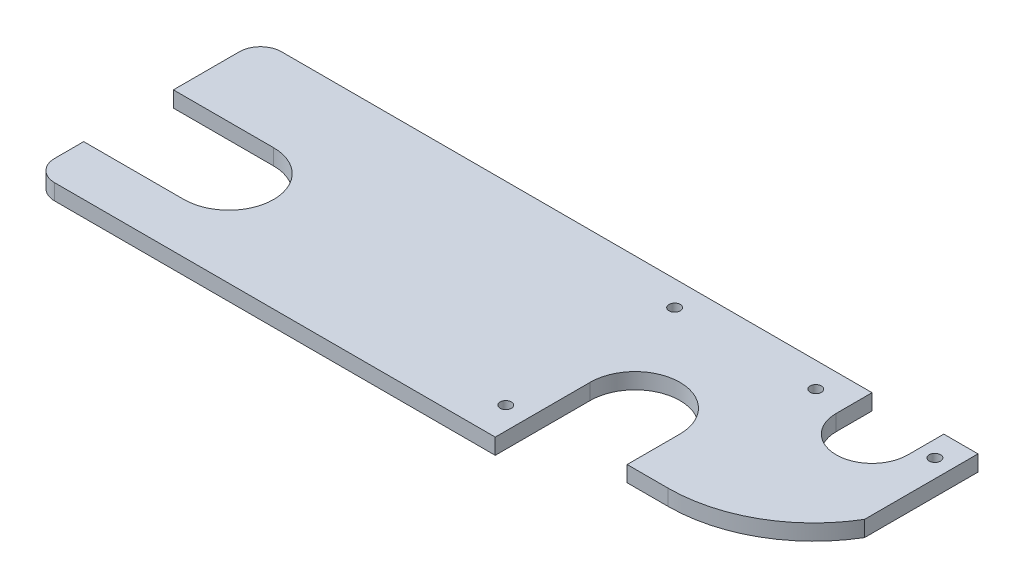
ISO-10303-21;
HEADER;
FILE_DESCRIPTION(('STEP AP214'),'2;1');
FILE_NAME('part.step','',(''),(''),'','','');
FILE_SCHEMA(('AUTOMOTIVE_DESIGN { 1 0 10303 214 1 1 1 1 }'));
ENDSEC;
DATA;
#1=APPLICATION_CONTEXT('core data for automotive mechanical design processes');
#2=APPLICATION_PROTOCOL_DEFINITION('international standard','automotive_design',2000,#1);
#3=PRODUCT_CONTEXT('',#1,'mechanical');
#4=PRODUCT('Part','Part','',(#3));
#5=PRODUCT_RELATED_PRODUCT_CATEGORY('part','',(#4));
#6=PRODUCT_DEFINITION_FORMATION('','',#4);
#7=PRODUCT_DEFINITION_CONTEXT('part definition',#1,'design');
#8=PRODUCT_DEFINITION('design','',#6,#7);
#9=PRODUCT_DEFINITION_SHAPE('','',#8);
#10=(LENGTH_UNIT() NAMED_UNIT(*) SI_UNIT(.MILLI.,.METRE.));
#11=(NAMED_UNIT(*) PLANE_ANGLE_UNIT() SI_UNIT($,.RADIAN.));
#12=(NAMED_UNIT(*) SI_UNIT($,.STERADIAN.) SOLID_ANGLE_UNIT());
#13=UNCERTAINTY_MEASURE_WITH_UNIT(LENGTH_MEASURE(1.E-05),#10,'distance_accuracy_value','');
#14=(GEOMETRIC_REPRESENTATION_CONTEXT(3) GLOBAL_UNCERTAINTY_ASSIGNED_CONTEXT((#13)) GLOBAL_UNIT_ASSIGNED_CONTEXT((#10,
#11,#12)) REPRESENTATION_CONTEXT('',''));
#15=CARTESIAN_POINT('',(0.,0.,0.));
#16=DIRECTION('',(0.,0.,1.));
#17=DIRECTION('',(1.,0.,0.));
#18=AXIS2_PLACEMENT_3D('',#15,#16,#17);
#19=CARTESIAN_POINT('',(12.7,9.525,-123.825));
#20=DIRECTION('',(0.,-1.,0.));
#21=DIRECTION('',(0.,0.,-1.));
#22=AXIS2_PLACEMENT_3D('',#19,#20,#21);
#23=CYLINDRICAL_SURFACE('',#22,12.7);
#24=CARTESIAN_POINT('',(12.7,0.,-123.825));
#25=DIRECTION('',(0.,-1.,0.));
#26=DIRECTION('',(0.,0.,-1.));
#27=AXIS2_PLACEMENT_3D('',#24,#25,#26);
#28=CIRCLE('',#27,12.7);
#29=CARTESIAN_POINT('',(0.,0.,-123.825));
#30=VERTEX_POINT('',#29);
#31=CARTESIAN_POINT('',(12.7,0.,-136.525));
#32=VERTEX_POINT('',#31);
#33=EDGE_CURVE('E237',#30,#32,#28,.T.);
#34=ORIENTED_EDGE('',*,*,#33,.F.);
#35=DIRECTION('',(0.,-1.,0.));
#36=VECTOR('',#35,1.);
#37=CARTESIAN_POINT('',(0.,9.525,-123.825));
#38=LINE('',#37,#36);
#39=CARTESIAN_POINT('',(0.,9.525,-123.825));
#40=VERTEX_POINT('',#39);
#41=EDGE_CURVE('E53',#40,#30,#38,.T.);
#42=ORIENTED_EDGE('',*,*,#41,.F.);
#43=CARTESIAN_POINT('',(12.7,9.525,-123.825));
#44=DIRECTION('',(0.,-1.,0.));
#45=DIRECTION('',(0.,0.,-1.));
#46=AXIS2_PLACEMENT_3D('',#43,#44,#45);
#47=CIRCLE('',#46,12.7);
#48=CARTESIAN_POINT('',(12.7,9.525,-136.525));
#49=VERTEX_POINT('',#48);
#50=EDGE_CURVE('E194',#40,#49,#47,.T.);
#51=ORIENTED_EDGE('',*,*,#50,.T.);
#52=DIRECTION('',(0.,-1.,0.));
#53=VECTOR('',#52,1.);
#54=CARTESIAN_POINT('',(12.7,9.525,-136.525));
#55=LINE('',#54,#53);
#56=EDGE_CURVE('E13',#49,#32,#55,.T.);
#57=ORIENTED_EDGE('',*,*,#56,.T.);
#58=EDGE_LOOP('',(#34,#42,#51,#57));
#59=FACE_BOUND('',#58,.T.);
#60=ADVANCED_FACE('F44',(#59),#23,.T.);
#61=CARTESIAN_POINT('',(0.,9.525,-96.8375000000001));
#62=DIRECTION('',(-1.,0.,0.));
#63=DIRECTION('',(0.,0.,1.));
#64=AXIS2_PLACEMENT_3D('',#61,#62,#63);
#65=PLANE('',#64);
#66=DIRECTION('',(0.,0.,-1.));
#67=VECTOR('',#66,1.);
#68=CARTESIAN_POINT('',(0.,0.,-96.8375000000001));
#69=LINE('',#68,#67);
#70=CARTESIAN_POINT('',(0.,0.,-84.1375));
#71=VERTEX_POINT('',#70);
#72=EDGE_CURVE('E188',#71,#30,#69,.T.);
#73=ORIENTED_EDGE('',*,*,#72,.F.);
#74=DIRECTION('',(0.,-1.,0.));
#75=VECTOR('',#74,1.);
#76=CARTESIAN_POINT('',(0.,9.525,-84.1375));
#77=LINE('',#76,#75);
#78=CARTESIAN_POINT('',(0.,9.525,-84.1375));
#79=VERTEX_POINT('',#78);
#80=EDGE_CURVE('E174',#79,#71,#77,.T.);
#81=ORIENTED_EDGE('',*,*,#80,.F.);
#82=DIRECTION('',(0.,0.,-1.));
#83=VECTOR('',#82,1.);
#84=CARTESIAN_POINT('',(0.,9.525,-84.1375));
#85=LINE('',#84,#83);
#86=EDGE_CURVE('E181',#79,#40,#85,.T.);
#87=ORIENTED_EDGE('',*,*,#86,.T.);
#88=ORIENTED_EDGE('',*,*,#41,.T.);
#89=EDGE_LOOP('',(#73,#81,#87,#88));
#90=FACE_BOUND('',#89,.T.);
#91=ADVANCED_FACE('F185',(#90),#65,.T.);
#92=CARTESIAN_POINT('',(22.2250000000001,9.525,-84.1375));
#93=DIRECTION('',(0.,0.,1.));
#94=DIRECTION('',(1.,0.,0.));
#95=AXIS2_PLACEMENT_3D('',#92,#93,#94);
#96=PLANE('',#95);
#97=DIRECTION('',(-1.,0.,0.));
#98=VECTOR('',#97,1.);
#99=CARTESIAN_POINT('',(22.2250000000001,0.,-84.1375));
#100=LINE('',#99,#98);
#101=CARTESIAN_POINT('',(60.325,0.,-84.1375));
#102=VERTEX_POINT('',#101);
#103=EDGE_CURVE('E234',#102,#71,#100,.T.);
#104=ORIENTED_EDGE('',*,*,#103,.F.);
#105=DIRECTION('',(0.,-1.,0.));
#106=VECTOR('',#105,1.);
#107=CARTESIAN_POINT('',(60.325,9.525,-84.1375));
#108=LINE('',#107,#106);
#109=CARTESIAN_POINT('',(60.325,9.525,-84.1375));
#110=VERTEX_POINT('',#109);
#111=EDGE_CURVE('E177',#110,#102,#108,.T.);
#112=ORIENTED_EDGE('',*,*,#111,.F.);
#113=DIRECTION('',(-1.,0.,0.));
#114=VECTOR('',#113,1.);
#115=CARTESIAN_POINT('',(60.325,9.525,-84.1375));
#116=LINE('',#115,#114);
#117=EDGE_CURVE('E171',#110,#79,#116,.T.);
#118=ORIENTED_EDGE('',*,*,#117,.T.);
#119=ORIENTED_EDGE('',*,*,#80,.T.);
#120=EDGE_LOOP('',(#104,#112,#118,#119));
#121=FACE_BOUND('',#120,.T.);
#122=ADVANCED_FACE('F173',(#121),#96,.T.);
#123=CARTESIAN_POINT('',(60.325,9.525,-57.15));
#124=DIRECTION('',(0.,-1.,0.));
#125=DIRECTION('',(0.,0.,-1.));
#126=AXIS2_PLACEMENT_3D('',#123,#124,#125);
#127=CYLINDRICAL_SURFACE('',#126,26.9875);
#128=CARTESIAN_POINT('',(60.325,0.,-57.15));
#129=DIRECTION('',(0.,-1.,0.));
#130=DIRECTION('',(0.,0.,-1.));
#131=AXIS2_PLACEMENT_3D('',#128,#129,#130);
#132=CIRCLE('',#131,26.9875);
#133=CARTESIAN_POINT('',(60.325,0.,-30.1625));
#134=VERTEX_POINT('',#133);
#135=EDGE_CURVE('E232',#102,#134,#132,.T.);
#136=ORIENTED_EDGE('',*,*,#135,.T.);
#137=DIRECTION('',(0.,-1.,0.));
#138=VECTOR('',#137,1.);
#139=CARTESIAN_POINT('',(60.325,9.525,-30.1625));
#140=LINE('',#139,#138);
#141=CARTESIAN_POINT('',(60.325,9.525,-30.1625));
#142=VERTEX_POINT('',#141);
#143=EDGE_CURVE('E242',#142,#134,#140,.T.);
#144=ORIENTED_EDGE('',*,*,#143,.F.);
#145=CARTESIAN_POINT('',(60.325,9.525,-57.15));
#146=DIRECTION('',(0.,1.,0.));
#147=DIRECTION('',(0.,0.,1.));
#148=AXIS2_PLACEMENT_3D('',#145,#146,#147);
#149=CIRCLE('',#148,26.9875);
#150=EDGE_CURVE('E182',#142,#110,#149,.T.);
#151=ORIENTED_EDGE('',*,*,#150,.T.);
#152=ORIENTED_EDGE('',*,*,#111,.T.);
#153=EDGE_LOOP('',(#136,#144,#151,#152));
#154=FACE_BOUND('',#153,.T.);
#155=ADVANCED_FACE('F293',(#154),#127,.F.);
#156=CARTESIAN_POINT('',(60.325,9.525,-30.1625));
#157=DIRECTION('',(0.,0.,1.));
#158=DIRECTION('',(1.,0.,0.));
#159=AXIS2_PLACEMENT_3D('',#156,#157,#158);
#160=PLANE('',#159);
#161=DIRECTION('',(-1.,0.,0.));
#162=VECTOR('',#161,1.);
#163=CARTESIAN_POINT('',(60.325,0.,-30.1625));
#164=LINE('',#163,#162);
#165=CARTESIAN_POINT('',(0.,0.,-30.1625));
#166=VERTEX_POINT('',#165);
#167=EDGE_CURVE('E230',#134,#166,#164,.T.);
#168=ORIENTED_EDGE('',*,*,#167,.T.);
#169=DIRECTION('',(0.,-1.,0.));
#170=VECTOR('',#169,1.);
#171=CARTESIAN_POINT('',(0.,9.525,-30.1625));
#172=LINE('',#171,#170);
#173=CARTESIAN_POINT('',(0.,9.525,-30.1625));
#174=VERTEX_POINT('',#173);
#175=EDGE_CURVE('E245',#174,#166,#172,.T.);
#176=ORIENTED_EDGE('',*,*,#175,.F.);
#177=DIRECTION('',(-1.,0.,0.));
#178=VECTOR('',#177,1.);
#179=CARTESIAN_POINT('',(22.2250000000001,9.525,-30.1625));
#180=LINE('',#179,#178);
#181=EDGE_CURVE('E449',#142,#174,#180,.T.);
#182=ORIENTED_EDGE('',*,*,#181,.F.);
#183=ORIENTED_EDGE('',*,*,#143,.T.);
#184=EDGE_LOOP('',(#168,#176,#182,#183));
#185=FACE_BOUND('',#184,.T.);
#186=ADVANCED_FACE('F296',(#185),#160,.F.);
#187=CARTESIAN_POINT('',(0.,9.525,-30.1625));
#188=DIRECTION('',(1.,0.,0.));
#189=DIRECTION('',(0.,0.,-1.));
#190=AXIS2_PLACEMENT_3D('',#187,#188,#189);
#191=PLANE('',#190);
#192=DIRECTION('',(0.,0.,1.));
#193=VECTOR('',#192,1.);
#194=CARTESIAN_POINT('',(0.,0.,-30.1625));
#195=LINE('',#194,#193);
#196=CARTESIAN_POINT('',(0.,0.,-12.7000000000001));
#197=VERTEX_POINT('',#196);
#198=EDGE_CURVE('E228',#166,#197,#195,.T.);
#199=ORIENTED_EDGE('',*,*,#198,.T.);
#200=DIRECTION('',(0.,-1.,0.));
#201=VECTOR('',#200,1.);
#202=CARTESIAN_POINT('',(0.,9.525,-12.7000000000001));
#203=LINE('',#202,#201);
#204=CARTESIAN_POINT('',(0.,9.525,-12.7000000000001));
#205=VERTEX_POINT('',#204);
#206=EDGE_CURVE('E248',#205,#197,#203,.T.);
#207=ORIENTED_EDGE('',*,*,#206,.F.);
#208=DIRECTION('',(0.,0.,1.));
#209=VECTOR('',#208,1.);
#210=CARTESIAN_POINT('',(0.,9.525,-17.4624999999999));
#211=LINE('',#210,#209);
#212=EDGE_CURVE('E447',#174,#205,#211,.T.);
#213=ORIENTED_EDGE('',*,*,#212,.F.);
#214=ORIENTED_EDGE('',*,*,#175,.T.);
#215=EDGE_LOOP('',(#199,#207,#213,#214));
#216=FACE_BOUND('',#215,.T.);
#217=ADVANCED_FACE('F300',(#216),#191,.F.);
#218=CARTESIAN_POINT('',(12.7,9.525,-12.7));
#219=DIRECTION('',(0.,-1.,0.));
#220=DIRECTION('',(0.,0.,-1.));
#221=AXIS2_PLACEMENT_3D('',#218,#219,#220);
#222=CYLINDRICAL_SURFACE('',#221,12.7);
#223=CARTESIAN_POINT('',(12.7,0.,-12.7));
#224=DIRECTION('',(0.,1.,0.));
#225=DIRECTION('',(0.,0.,1.));
#226=AXIS2_PLACEMENT_3D('',#223,#224,#225);
#227=CIRCLE('',#226,12.7);
#228=CARTESIAN_POINT('',(12.7000000000001,0.,0.));
#229=VERTEX_POINT('',#228);
#230=EDGE_CURVE('E226',#197,#229,#227,.T.);
#231=ORIENTED_EDGE('',*,*,#230,.T.);
#232=DIRECTION('',(0.,-1.,0.));
#233=VECTOR('',#232,1.);
#234=CARTESIAN_POINT('',(12.7000000000001,9.525,0.));
#235=LINE('',#234,#233);
#236=CARTESIAN_POINT('',(12.7000000000001,9.525,0.));
#237=VERTEX_POINT('',#236);
#238=EDGE_CURVE('E251',#237,#229,#235,.T.);
#239=ORIENTED_EDGE('',*,*,#238,.F.);
#240=CARTESIAN_POINT('',(12.7,9.525,-12.7));
#241=DIRECTION('',(0.,1.,0.));
#242=DIRECTION('',(0.,0.,1.));
#243=AXIS2_PLACEMENT_3D('',#240,#241,#242);
#244=CIRCLE('',#243,12.7);
#245=EDGE_CURVE('E444',#205,#237,#244,.T.);
#246=ORIENTED_EDGE('',*,*,#245,.F.);
#247=ORIENTED_EDGE('',*,*,#206,.T.);
#248=EDGE_LOOP('',(#231,#239,#246,#247));
#249=FACE_BOUND('',#248,.T.);
#250=ADVANCED_FACE('F304',(#249),#222,.T.);
#251=CARTESIAN_POINT('',(12.7000000000001,9.525,0.));
#252=DIRECTION('',(0.,0.,-1.));
#253=DIRECTION('',(-1.,0.,0.));
#254=AXIS2_PLACEMENT_3D('',#251,#252,#253);
#255=PLANE('',#254);
#256=DIRECTION('',(1.,0.,0.));
#257=VECTOR('',#256,1.);
#258=CARTESIAN_POINT('',(12.7000000000001,0.,0.));
#259=LINE('',#258,#257);
#260=CARTESIAN_POINT('',(277.8125,0.,0.));
#261=VERTEX_POINT('',#260);
#262=EDGE_CURVE('E224',#229,#261,#259,.T.);
#263=ORIENTED_EDGE('',*,*,#262,.T.);
#264=DIRECTION('',(0.,-1.,0.));
#265=VECTOR('',#264,1.);
#266=CARTESIAN_POINT('',(277.8125,9.525,0.));
#267=LINE('',#266,#265);
#268=CARTESIAN_POINT('',(277.8125,9.525,0.));
#269=VERTEX_POINT('',#268);
#270=EDGE_CURVE('E254',#269,#261,#267,.T.);
#271=ORIENTED_EDGE('',*,*,#270,.F.);
#272=DIRECTION('',(1.,0.,0.));
#273=VECTOR('',#272,1.);
#274=CARTESIAN_POINT('',(25.4,9.525,0.));
#275=LINE('',#274,#273);
#276=EDGE_CURVE('E442',#237,#269,#275,.T.);
#277=ORIENTED_EDGE('',*,*,#276,.F.);
#278=ORIENTED_EDGE('',*,*,#238,.T.);
#279=EDGE_LOOP('',(#263,#271,#277,#278));
#280=FACE_BOUND('',#279,.T.);
#281=ADVANCED_FACE('F308',(#280),#255,.F.);
#282=CARTESIAN_POINT('',(277.8125,9.525,-57.15));
#283=DIRECTION('',(1.,0.,0.));
#284=DIRECTION('',(0.,0.,-1.));
#285=AXIS2_PLACEMENT_3D('',#282,#283,#284);
#286=PLANE('',#285);
#287=DIRECTION('',(0.,0.,1.));
#288=VECTOR('',#287,1.);
#289=CARTESIAN_POINT('',(277.8125,0.,-57.15));
#290=LINE('',#289,#288);
#291=CARTESIAN_POINT('',(277.812500035128,0.,-57.15));
#292=VERTEX_POINT('',#291);
#293=EDGE_CURVE('E221',#292,#261,#290,.T.);
#294=ORIENTED_EDGE('',*,*,#293,.F.);
#295=DIRECTION('',(0.,-1.,0.));
#296=VECTOR('',#295,1.);
#297=CARTESIAN_POINT('',(277.812500035128,9.525,-57.15));
#298=LINE('',#297,#296);
#299=CARTESIAN_POINT('',(277.812500035128,9.525,-57.15));
#300=VERTEX_POINT('',#299);
#301=EDGE_CURVE('E257',#300,#292,#298,.T.);
#302=ORIENTED_EDGE('',*,*,#301,.F.);
#303=DIRECTION('',(0.,0.,1.));
#304=VECTOR('',#303,1.);
#305=CARTESIAN_POINT('',(277.8125,9.525,-57.15));
#306=LINE('',#305,#304);
#307=EDGE_CURVE('E439',#300,#269,#306,.T.);
#308=ORIENTED_EDGE('',*,*,#307,.T.);
#309=ORIENTED_EDGE('',*,*,#270,.T.);
#310=EDGE_LOOP('',(#294,#302,#308,#309));
#311=FACE_BOUND('',#310,.T.);
#312=ADVANCED_FACE('F312',(#311),#286,.T.);
#313=CARTESIAN_POINT('',(304.8,9.525,-57.15));
#314=DIRECTION('',(0.,-1.,0.));
#315=DIRECTION('',(0.,0.,-1.));
#316=AXIS2_PLACEMENT_3D('',#313,#314,#315);
#317=CYLINDRICAL_SURFACE('',#316,26.9874999648723);
#318=CARTESIAN_POINT('',(304.8,0.,-57.15));
#319=DIRECTION('',(0.,-1.,0.));
#320=DIRECTION('',(0.,0.,-1.));
#321=AXIS2_PLACEMENT_3D('',#318,#319,#320);
#322=CIRCLE('',#321,26.9874999648723);
#323=CARTESIAN_POINT('',(331.787499929745,0.,-57.15));
#324=VERTEX_POINT('',#323);
#325=EDGE_CURVE('E219',#292,#324,#322,.T.);
#326=ORIENTED_EDGE('',*,*,#325,.T.);
#327=DIRECTION('',(0.,-1.,0.));
#328=VECTOR('',#327,1.);
#329=CARTESIAN_POINT('',(331.787499929745,9.525,-57.15));
#330=LINE('',#329,#328);
#331=CARTESIAN_POINT('',(331.787499929745,9.525,-57.15));
#332=VERTEX_POINT('',#331);
#333=EDGE_CURVE('E259',#332,#324,#330,.T.);
#334=ORIENTED_EDGE('',*,*,#333,.F.);
#335=CARTESIAN_POINT('',(304.8,9.525,-57.15));
#336=DIRECTION('',(0.,-1.,0.));
#337=DIRECTION('',(0.,0.,-1.));
#338=AXIS2_PLACEMENT_3D('',#335,#336,#337);
#339=CIRCLE('',#338,26.9874999648723);
#340=EDGE_CURVE('E437',#300,#332,#339,.T.);
#341=ORIENTED_EDGE('',*,*,#340,.F.);
#342=ORIENTED_EDGE('',*,*,#301,.T.);
#343=EDGE_LOOP('',(#326,#334,#341,#342));
#344=FACE_BOUND('',#343,.T.);
#345=ADVANCED_FACE('F316',(#344),#317,.F.);
#346=CARTESIAN_POINT('',(331.787499929745,9.525,-57.15));
#347=DIRECTION('',(1.,0.,0.));
#348=DIRECTION('',(0.,0.,-1.));
#349=AXIS2_PLACEMENT_3D('',#346,#347,#348);
#350=PLANE('',#349);
#351=DIRECTION('',(0.,0.,1.));
#352=VECTOR('',#351,1.);
#353=CARTESIAN_POINT('',(331.787499929745,0.,-57.15));
#354=LINE('',#353,#352);
#355=CARTESIAN_POINT('',(331.787499929745,0.,-25.4));
#356=VERTEX_POINT('',#355);
#357=EDGE_CURVE('E216',#324,#356,#354,.T.);
#358=ORIENTED_EDGE('',*,*,#357,.T.);
#359=DIRECTION('',(0.,1.,0.));
#360=VECTOR('',#359,1.);
#361=CARTESIAN_POINT('',(331.787499929745,0.,-25.4));
#362=LINE('',#361,#360);
#363=CARTESIAN_POINT('',(331.787499929745,9.525,-25.4));
#364=VERTEX_POINT('',#363);
#365=EDGE_CURVE('E411',#356,#364,#362,.T.);
#366=ORIENTED_EDGE('',*,*,#365,.T.);
#367=DIRECTION('',(0.,0.,1.));
#368=VECTOR('',#367,1.);
#369=CARTESIAN_POINT('',(331.787499929745,9.525,-57.15));
#370=LINE('',#369,#368);
#371=EDGE_CURVE('E434',#332,#364,#370,.T.);
#372=ORIENTED_EDGE('',*,*,#371,.F.);
#373=ORIENTED_EDGE('',*,*,#333,.T.);
#374=EDGE_LOOP('',(#358,#366,#372,#373));
#375=FACE_BOUND('',#374,.T.);
#376=ADVANCED_FACE('F320',(#375),#350,.F.);
#377=CARTESIAN_POINT('',(431.8,9.525,-136.525));
#378=DIRECTION('',(1.,0.,0.));
#379=DIRECTION('',(0.,0.,-1.));
#380=AXIS2_PLACEMENT_3D('',#377,#378,#379);
#381=PLANE('',#380);
#382=DIRECTION('',(0.,0.,1.));
#383=VECTOR('',#382,1.);
#384=CARTESIAN_POINT('',(431.8,0.,-136.525));
#385=LINE('',#384,#383);
#386=CARTESIAN_POINT('',(431.8,0.,-136.525));
#387=VERTEX_POINT('',#386);
#388=CARTESIAN_POINT('',(431.8,0.,-68.2625));
#389=VERTEX_POINT('',#388);
#390=EDGE_CURVE('E213',#387,#389,#385,.T.);
#391=ORIENTED_EDGE('',*,*,#390,.F.);
#392=DIRECTION('',(0.,-1.,0.));
#393=VECTOR('',#392,1.);
#394=CARTESIAN_POINT('',(431.8,9.525,-136.525));
#395=LINE('',#394,#393);
#396=CARTESIAN_POINT('',(431.8,9.525,-136.525));
#397=VERTEX_POINT('',#396);
#398=EDGE_CURVE('E265',#397,#387,#395,.T.);
#399=ORIENTED_EDGE('',*,*,#398,.F.);
#400=DIRECTION('',(0.,0.,1.));
#401=VECTOR('',#400,1.);
#402=CARTESIAN_POINT('',(431.8,9.525,-136.525));
#403=LINE('',#402,#401);
#404=CARTESIAN_POINT('',(431.8,9.525,-68.2625));
#405=VERTEX_POINT('',#404);
#406=EDGE_CURVE('E431',#397,#405,#403,.T.);
#407=ORIENTED_EDGE('',*,*,#406,.T.);
#408=DIRECTION('',(0.,-1.,0.));
#409=VECTOR('',#408,1.);
#410=CARTESIAN_POINT('',(431.8,9.525,-68.2625));
#411=LINE('',#410,#409);
#412=EDGE_CURVE('E262',#405,#389,#411,.T.);
#413=ORIENTED_EDGE('',*,*,#412,.T.);
#414=EDGE_LOOP('',(#391,#399,#407,#413));
#415=FACE_BOUND('',#414,.T.);
#416=ADVANCED_FACE('F324',(#415),#381,.T.);
#417=CARTESIAN_POINT('',(411.226,9.525,-136.525));
#418=DIRECTION('',(0.,0.,-1.));
#419=DIRECTION('',(-1.,0.,0.));
#420=AXIS2_PLACEMENT_3D('',#417,#418,#419);
#421=PLANE('',#420);
#422=DIRECTION('',(1.,0.,0.));
#423=VECTOR('',#422,1.);
#424=CARTESIAN_POINT('',(411.226,0.,-136.525));
#425=LINE('',#424,#423);
#426=CARTESIAN_POINT('',(411.226,0.,-136.525));
#427=VERTEX_POINT('',#426);
#428=EDGE_CURVE('E210',#427,#387,#425,.T.);
#429=ORIENTED_EDGE('',*,*,#428,.F.);
#430=DIRECTION('',(0.,-1.,0.));
#431=VECTOR('',#430,1.);
#432=CARTESIAN_POINT('',(411.226,9.525,-136.525));
#433=LINE('',#432,#431);
#434=CARTESIAN_POINT('',(411.226,9.525,-136.525));
#435=VERTEX_POINT('',#434);
#436=EDGE_CURVE('E267',#435,#427,#433,.T.);
#437=ORIENTED_EDGE('',*,*,#436,.F.);
#438=DIRECTION('',(1.,0.,0.));
#439=VECTOR('',#438,1.);
#440=CARTESIAN_POINT('',(411.226,9.525,-136.525));
#441=LINE('',#440,#439);
#442=EDGE_CURVE('E428',#435,#397,#441,.T.);
#443=ORIENTED_EDGE('',*,*,#442,.T.);
#444=ORIENTED_EDGE('',*,*,#398,.T.);
#445=EDGE_LOOP('',(#429,#437,#443,#444));
#446=FACE_BOUND('',#445,.T.);
#447=ADVANCED_FACE('F328',(#446),#421,.T.);
#448=CARTESIAN_POINT('',(411.226,9.525,-114.935));
#449=DIRECTION('',(-1.,0.,0.));
#450=DIRECTION('',(0.,0.,1.));
#451=AXIS2_PLACEMENT_3D('',#448,#449,#450);
#452=PLANE('',#451);
#453=DIRECTION('',(0.,0.,-1.));
#454=VECTOR('',#453,1.);
#455=CARTESIAN_POINT('',(411.226,0.,-114.935));
#456=LINE('',#455,#454);
#457=CARTESIAN_POINT('',(411.226,0.,-114.935));
#458=VERTEX_POINT('',#457);
#459=EDGE_CURVE('E207',#458,#427,#456,.T.);
#460=ORIENTED_EDGE('',*,*,#459,.F.);
#461=DIRECTION('',(0.,-1.,0.));
#462=VECTOR('',#461,1.);
#463=CARTESIAN_POINT('',(411.226,9.525,-114.935));
#464=LINE('',#463,#462);
#465=CARTESIAN_POINT('',(411.226,9.525,-114.935));
#466=VERTEX_POINT('',#465);
#467=EDGE_CURVE('E269',#466,#458,#464,.T.);
#468=ORIENTED_EDGE('',*,*,#467,.F.);
#469=DIRECTION('',(0.,0.,-1.));
#470=VECTOR('',#469,1.);
#471=CARTESIAN_POINT('',(411.226,9.525,-114.935));
#472=LINE('',#471,#470);
#473=EDGE_CURVE('E425',#466,#435,#472,.T.);
#474=ORIENTED_EDGE('',*,*,#473,.T.);
#475=ORIENTED_EDGE('',*,*,#436,.T.);
#476=EDGE_LOOP('',(#460,#468,#474,#475));
#477=FACE_BOUND('',#476,.T.);
#478=ADVANCED_FACE('F332',(#477),#452,.T.);
#479=CARTESIAN_POINT('',(389.636,9.525,-114.935));
#480=DIRECTION('',(0.,-1.,0.));
#481=DIRECTION('',(0.,0.,-1.));
#482=AXIS2_PLACEMENT_3D('',#479,#480,#481);
#483=CYLINDRICAL_SURFACE('',#482,21.59);
#484=CARTESIAN_POINT('',(389.636,0.,-114.935));
#485=DIRECTION('',(0.,1.,0.));
#486=DIRECTION('',(0.,0.,1.));
#487=AXIS2_PLACEMENT_3D('',#484,#485,#486);
#488=CIRCLE('',#487,21.59);
#489=CARTESIAN_POINT('',(368.046,0.,-114.935));
#490=VERTEX_POINT('',#489);
#491=EDGE_CURVE('E204',#490,#458,#488,.T.);
#492=ORIENTED_EDGE('',*,*,#491,.F.);
#493=DIRECTION('',(0.,-1.,0.));
#494=VECTOR('',#493,1.);
#495=CARTESIAN_POINT('',(368.046,9.525,-114.935));
#496=LINE('',#495,#494);
#497=CARTESIAN_POINT('',(368.046,9.525,-114.935));
#498=VERTEX_POINT('',#497);
#499=EDGE_CURVE('E270',#498,#490,#496,.T.);
#500=ORIENTED_EDGE('',*,*,#499,.F.);
#501=CARTESIAN_POINT('',(389.636,9.525,-114.935));
#502=DIRECTION('',(0.,1.,0.));
#503=DIRECTION('',(0.,0.,1.));
#504=AXIS2_PLACEMENT_3D('',#501,#502,#503);
#505=CIRCLE('',#504,21.59);
#506=EDGE_CURVE('E422',#498,#466,#505,.T.);
#507=ORIENTED_EDGE('',*,*,#506,.T.);
#508=ORIENTED_EDGE('',*,*,#467,.T.);
#509=EDGE_LOOP('',(#492,#500,#507,#508));
#510=FACE_BOUND('',#509,.T.);
#511=ADVANCED_FACE('F336',(#510),#483,.F.);
#512=CARTESIAN_POINT('',(368.046,9.525,-114.935));
#513=DIRECTION('',(-1.,0.,0.));
#514=DIRECTION('',(0.,0.,1.));
#515=AXIS2_PLACEMENT_3D('',#512,#513,#514);
#516=PLANE('',#515);
#517=DIRECTION('',(0.,0.,-1.));
#518=VECTOR('',#517,1.);
#519=CARTESIAN_POINT('',(368.046,0.,-114.935));
#520=LINE('',#519,#518);
#521=CARTESIAN_POINT('',(368.046,0.,-136.525));
#522=VERTEX_POINT('',#521);
#523=EDGE_CURVE('E200',#490,#522,#520,.T.);
#524=ORIENTED_EDGE('',*,*,#523,.T.);
#525=DIRECTION('',(0.,-1.,0.));
#526=VECTOR('',#525,1.);
#527=CARTESIAN_POINT('',(368.046,9.525,-136.525));
#528=LINE('',#527,#526);
#529=CARTESIAN_POINT('',(368.046,9.525,-136.525));
#530=VERTEX_POINT('',#529);
#531=EDGE_CURVE('E48',#530,#522,#528,.T.);
#532=ORIENTED_EDGE('',*,*,#531,.F.);
#533=DIRECTION('',(0.,0.,-1.));
#534=VECTOR('',#533,1.);
#535=CARTESIAN_POINT('',(368.046,9.525,-114.935));
#536=LINE('',#535,#534);
#537=EDGE_CURVE('E420',#498,#530,#536,.T.);
#538=ORIENTED_EDGE('',*,*,#537,.F.);
#539=ORIENTED_EDGE('',*,*,#499,.T.);
#540=EDGE_LOOP('',(#524,#532,#538,#539));
#541=FACE_BOUND('',#540,.T.);
#542=ADVANCED_FACE('F275',(#541),#516,.F.);
#543=CARTESIAN_POINT('',(23.8125,9.525,-136.525));
#544=DIRECTION('',(0.,0.,-1.));
#545=DIRECTION('',(-1.,0.,0.));
#546=AXIS2_PLACEMENT_3D('',#543,#544,#545);
#547=PLANE('',#546);
#548=DIRECTION('',(1.,0.,0.));
#549=VECTOR('',#548,1.);
#550=CARTESIAN_POINT('',(23.8125,0.,-136.525));
#551=LINE('',#550,#549);
#552=EDGE_CURVE('E123',#32,#522,#551,.T.);
#553=ORIENTED_EDGE('',*,*,#552,.F.);
#554=ORIENTED_EDGE('',*,*,#56,.F.);
#555=DIRECTION('',(1.,0.,0.));
#556=VECTOR('',#555,1.);
#557=CARTESIAN_POINT('',(12.7000000000001,9.525,-136.525));
#558=LINE('',#557,#556);
#559=EDGE_CURVE('E126',#49,#530,#558,.T.);
#560=ORIENTED_EDGE('',*,*,#559,.T.);
#561=ORIENTED_EDGE('',*,*,#531,.T.);
#562=EDGE_LOOP('',(#553,#554,#560,#561));
#563=FACE_BOUND('',#562,.T.);
#564=ADVANCED_FACE('F46',(#563),#547,.T.);
#565=CARTESIAN_POINT('',(389.636,9.525,-114.935));
#566=DIRECTION('',(0.,1.,0.));
#567=DIRECTION('',(0.,0.,1.));
#568=AXIS2_PLACEMENT_3D('',#565,#566,#567);
#569=PLANE('',#568);
#570=CARTESIAN_POINT('',(420.954199999999,9.525,-121.443750000001));
#571=DIRECTION('',(0.,1.,0.));
#572=DIRECTION('',(0.,0.,1.));
#573=AXIS2_PLACEMENT_3D('',#570,#571,#572);
#574=CIRCLE('',#573,3.3782);
#575=CARTESIAN_POINT('',(420.954199999999,9.525,-118.065550000001));
#576=VERTEX_POINT('',#575);
#577=EDGE_CURVE('E384',#576,#576,#574,.T.);
#578=ORIENTED_EDGE('',*,*,#577,.F.);
#579=EDGE_LOOP('',(#578));
#580=FACE_BOUND('',#579,.T.);
#581=CARTESIAN_POINT('',(349.269049999999,9.525,-121.443750000001));
#582=DIRECTION('',(0.,1.,0.));
#583=DIRECTION('',(0.,0.,1.));
#584=AXIS2_PLACEMENT_3D('',#581,#582,#583);
#585=CIRCLE('',#584,3.3782);
#586=CARTESIAN_POINT('',(349.269049999999,9.525,-118.065550000001));
#587=VERTEX_POINT('',#586);
#588=EDGE_CURVE('E386',#587,#587,#585,.T.);
#589=ORIENTED_EDGE('',*,*,#588,.F.);
#590=EDGE_LOOP('',(#589));
#591=FACE_BOUND('',#590,.T.);
#592=CARTESIAN_POINT('',(264.318750035127,9.525,-121.443750000001));
#593=DIRECTION('',(0.,1.,0.));
#594=DIRECTION('',(0.,0.,1.));
#595=AXIS2_PLACEMENT_3D('',#592,#593,#594);
#596=CIRCLE('',#595,3.3782);
#597=CARTESIAN_POINT('',(264.318750035127,9.525,-118.065550000001));
#598=VERTEX_POINT('',#597);
#599=EDGE_CURVE('E394',#598,#598,#596,.T.);
#600=ORIENTED_EDGE('',*,*,#599,.F.);
#601=EDGE_LOOP('',(#600));
#602=FACE_BOUND('',#601,.T.);
#603=CARTESIAN_POINT('',(264.318750035127,9.525,-19.84375));
#604=DIRECTION('',(0.,1.,0.));
#605=DIRECTION('',(0.,0.,1.));
#606=AXIS2_PLACEMENT_3D('',#603,#604,#605);
#607=CIRCLE('',#606,3.3782);
#608=CARTESIAN_POINT('',(264.318750035127,9.525,-16.46555));
#609=VERTEX_POINT('',#608);
#610=EDGE_CURVE('E400',#609,#609,#607,.T.);
#611=ORIENTED_EDGE('',*,*,#610,.F.);
#612=EDGE_LOOP('',(#611));
#613=FACE_BOUND('',#612,.T.);
#614=DIRECTION('',(-1.,0.,0.));
#615=VECTOR('',#614,1.);
#616=CARTESIAN_POINT('',(331.787499929745,9.525,-25.4));
#617=LINE('',#616,#615);
#618=CARTESIAN_POINT('',(356.39375,9.525,-25.4));
#619=VERTEX_POINT('',#618);
#620=EDGE_CURVE('E406',#619,#364,#617,.T.);
#621=ORIENTED_EDGE('',*,*,#620,.F.);
#622=CARTESIAN_POINT('',(356.39375,9.525,-113.160821759259));
#623=DIRECTION('',(0.,-1.,0.));
#624=DIRECTION('',(0.,0.,1.));
#625=AXIS2_PLACEMENT_3D('',#622,#623,#624);
#626=CIRCLE('',#625,87.7608217592593);
#627=EDGE_CURVE('E409',#405,#619,#626,.T.);
#628=ORIENTED_EDGE('',*,*,#627,.F.);
#629=ORIENTED_EDGE('',*,*,#406,.F.);
#630=ORIENTED_EDGE('',*,*,#442,.F.);
#631=ORIENTED_EDGE('',*,*,#473,.F.);
#632=ORIENTED_EDGE('',*,*,#506,.F.);
#633=ORIENTED_EDGE('',*,*,#537,.T.);
#634=ORIENTED_EDGE('',*,*,#559,.F.);
#635=ORIENTED_EDGE('',*,*,#50,.F.);
#636=ORIENTED_EDGE('',*,*,#86,.F.);
#637=ORIENTED_EDGE('',*,*,#117,.F.);
#638=ORIENTED_EDGE('',*,*,#150,.F.);
#639=ORIENTED_EDGE('',*,*,#181,.T.);
#640=ORIENTED_EDGE('',*,*,#212,.T.);
#641=ORIENTED_EDGE('',*,*,#245,.T.);
#642=ORIENTED_EDGE('',*,*,#276,.T.);
#643=ORIENTED_EDGE('',*,*,#307,.F.);
#644=ORIENTED_EDGE('',*,*,#340,.T.);
#645=ORIENTED_EDGE('',*,*,#371,.T.);
#646=EDGE_LOOP('',(#621,#628,#629,#630,#631,#632,#633,#634,#635,#636,#637,#638,#639,#640,#641,
#642,#643,#644,#645));
#647=FACE_BOUND('',#646,.T.);
#648=ADVANCED_FACE('F192',(#580,#591,#602,#613,#647),#569,.T.);
#649=CARTESIAN_POINT('',(389.636,0.,-114.935));
#650=DIRECTION('',(0.,1.,0.));
#651=DIRECTION('',(0.,0.,1.));
#652=AXIS2_PLACEMENT_3D('',#649,#650,#651);
#653=PLANE('',#652);
#654=CARTESIAN_POINT('',(420.954199999999,0.,-121.443750000001));
#655=DIRECTION('',(0.,1.,0.));
#656=DIRECTION('',(0.,0.,1.));
#657=AXIS2_PLACEMENT_3D('',#654,#655,#656);
#658=CIRCLE('',#657,3.3782);
#659=CARTESIAN_POINT('',(420.954199999999,0.,-118.065550000001));
#660=VERTEX_POINT('',#659);
#661=EDGE_CURVE('E382',#660,#660,#658,.T.);
#662=ORIENTED_EDGE('',*,*,#661,.T.);
#663=EDGE_LOOP('',(#662));
#664=FACE_BOUND('',#663,.T.);
#665=CARTESIAN_POINT('',(349.269049999999,0.,-121.443750000001));
#666=DIRECTION('',(0.,1.,0.));
#667=DIRECTION('',(0.,0.,1.));
#668=AXIS2_PLACEMENT_3D('',#665,#666,#667);
#669=CIRCLE('',#668,3.3782);
#670=CARTESIAN_POINT('',(349.269049999999,0.,-118.065550000001));
#671=VERTEX_POINT('',#670);
#672=EDGE_CURVE('E391',#671,#671,#669,.T.);
#673=ORIENTED_EDGE('',*,*,#672,.T.);
#674=EDGE_LOOP('',(#673));
#675=FACE_BOUND('',#674,.T.);
#676=CARTESIAN_POINT('',(264.318750035127,0.,-121.443750000001));
#677=DIRECTION('',(0.,1.,0.));
#678=DIRECTION('',(0.,0.,1.));
#679=AXIS2_PLACEMENT_3D('',#676,#677,#678);
#680=CIRCLE('',#679,3.3782);
#681=CARTESIAN_POINT('',(264.318750035127,0.,-118.065550000001));
#682=VERTEX_POINT('',#681);
#683=EDGE_CURVE('E397',#682,#682,#680,.T.);
#684=ORIENTED_EDGE('',*,*,#683,.T.);
#685=EDGE_LOOP('',(#684));
#686=FACE_BOUND('',#685,.T.);
#687=CARTESIAN_POINT('',(264.318750035127,0.,-19.84375));
#688=DIRECTION('',(0.,1.,0.));
#689=DIRECTION('',(0.,0.,1.));
#690=AXIS2_PLACEMENT_3D('',#687,#688,#689);
#691=CIRCLE('',#690,3.3782);
#692=CARTESIAN_POINT('',(264.318750035127,0.,-16.46555));
#693=VERTEX_POINT('',#692);
#694=EDGE_CURVE('E403',#693,#693,#691,.T.);
#695=ORIENTED_EDGE('',*,*,#694,.T.);
#696=EDGE_LOOP('',(#695));
#697=FACE_BOUND('',#696,.T.);
#698=CARTESIAN_POINT('',(356.39375,0.,-113.160821759259));
#699=DIRECTION('',(0.,-1.,0.));
#700=DIRECTION('',(0.,0.,1.));
#701=AXIS2_PLACEMENT_3D('',#698,#699,#700);
#702=CIRCLE('',#701,87.7608217592593);
#703=CARTESIAN_POINT('',(356.39375,0.,-25.4));
#704=VERTEX_POINT('',#703);
#705=EDGE_CURVE('E408',#389,#704,#702,.T.);
#706=ORIENTED_EDGE('',*,*,#705,.T.);
#707=DIRECTION('',(-1.,0.,0.));
#708=VECTOR('',#707,1.);
#709=CARTESIAN_POINT('',(331.787499929745,0.,-25.4));
#710=LINE('',#709,#708);
#711=EDGE_CURVE('E61',#704,#356,#710,.T.);
#712=ORIENTED_EDGE('',*,*,#711,.T.);
#713=ORIENTED_EDGE('',*,*,#357,.F.);
#714=ORIENTED_EDGE('',*,*,#325,.F.);
#715=ORIENTED_EDGE('',*,*,#293,.T.);
#716=ORIENTED_EDGE('',*,*,#262,.F.);
#717=ORIENTED_EDGE('',*,*,#230,.F.);
#718=ORIENTED_EDGE('',*,*,#198,.F.);
#719=ORIENTED_EDGE('',*,*,#167,.F.);
#720=ORIENTED_EDGE('',*,*,#135,.F.);
#721=ORIENTED_EDGE('',*,*,#103,.T.);
#722=ORIENTED_EDGE('',*,*,#72,.T.);
#723=ORIENTED_EDGE('',*,*,#33,.T.);
#724=ORIENTED_EDGE('',*,*,#552,.T.);
#725=ORIENTED_EDGE('',*,*,#523,.F.);
#726=ORIENTED_EDGE('',*,*,#491,.T.);
#727=ORIENTED_EDGE('',*,*,#459,.T.);
#728=ORIENTED_EDGE('',*,*,#428,.T.);
#729=ORIENTED_EDGE('',*,*,#390,.T.);
#730=EDGE_LOOP('',(#706,#712,#713,#714,#715,#716,#717,#718,#719,#720,#721,#722,#723,#724,#725,
#726,#727,#728,#729));
#731=FACE_BOUND('',#730,.T.);
#732=ADVANCED_FACE('F279',(#664,#675,#686,#697,#731),#653,.F.);
#733=CARTESIAN_POINT('',(331.787499929745,0.,-25.4));
#734=DIRECTION('',(0.,0.,-1.));
#735=DIRECTION('',(-1.,0.,0.));
#736=AXIS2_PLACEMENT_3D('',#733,#734,#735);
#737=PLANE('',#736);
#738=ORIENTED_EDGE('',*,*,#620,.T.);
#739=ORIENTED_EDGE('',*,*,#365,.F.);
#740=ORIENTED_EDGE('',*,*,#711,.F.);
#741=DIRECTION('',(0.,1.,0.));
#742=VECTOR('',#741,1.);
#743=CARTESIAN_POINT('',(356.39375,0.,-25.4));
#744=LINE('',#743,#742);
#745=EDGE_CURVE('E201',#704,#619,#744,.T.);
#746=ORIENTED_EDGE('',*,*,#745,.T.);
#747=EDGE_LOOP('',(#738,#739,#740,#746));
#748=FACE_BOUND('',#747,.T.);
#749=ADVANCED_FACE('F351',(#748),#737,.F.);
#750=CARTESIAN_POINT('',(356.39375,0.,-113.160821759259));
#751=DIRECTION('',(0.,1.,0.));
#752=DIRECTION('',(0.,0.,1.));
#753=AXIS2_PLACEMENT_3D('',#750,#751,#752);
#754=CYLINDRICAL_SURFACE('',#753,87.7608217592593);
#755=ORIENTED_EDGE('',*,*,#627,.T.);
#756=ORIENTED_EDGE('',*,*,#745,.F.);
#757=ORIENTED_EDGE('',*,*,#705,.F.);
#758=ORIENTED_EDGE('',*,*,#412,.F.);
#759=EDGE_LOOP('',(#755,#756,#757,#758));
#760=FACE_BOUND('',#759,.T.);
#761=ADVANCED_FACE('F358',(#760),#754,.T.);
#762=CARTESIAN_POINT('',(264.318750035127,9.525,-19.84375));
#763=DIRECTION('',(0.,1.,0.));
#764=DIRECTION('',(0.,0.,1.));
#765=AXIS2_PLACEMENT_3D('',#762,#763,#764);
#766=CYLINDRICAL_SURFACE('',#765,3.3782);
#767=ORIENTED_EDGE('',*,*,#694,.F.);
#768=EDGE_LOOP('',(#767));
#769=FACE_BOUND('',#768,.T.);
#770=ORIENTED_EDGE('',*,*,#610,.T.);
#771=EDGE_LOOP('',(#770));
#772=FACE_BOUND('',#771,.T.);
#773=ADVANCED_FACE('F361',(#769,#772),#766,.F.);
#774=CARTESIAN_POINT('',(264.318750035127,9.525,-121.443750000001));
#775=DIRECTION('',(0.,1.,0.));
#776=DIRECTION('',(0.,0.,1.));
#777=AXIS2_PLACEMENT_3D('',#774,#775,#776);
#778=CYLINDRICAL_SURFACE('',#777,3.3782);
#779=ORIENTED_EDGE('',*,*,#683,.F.);
#780=EDGE_LOOP('',(#779));
#781=FACE_BOUND('',#780,.T.);
#782=ORIENTED_EDGE('',*,*,#599,.T.);
#783=EDGE_LOOP('',(#782));
#784=FACE_BOUND('',#783,.T.);
#785=ADVANCED_FACE('F365',(#781,#784),#778,.F.);
#786=CARTESIAN_POINT('',(349.269049999999,9.525,-121.443750000001));
#787=DIRECTION('',(0.,1.,0.));
#788=DIRECTION('',(0.,0.,1.));
#789=AXIS2_PLACEMENT_3D('',#786,#787,#788);
#790=CYLINDRICAL_SURFACE('',#789,3.3782);
#791=ORIENTED_EDGE('',*,*,#672,.F.);
#792=EDGE_LOOP('',(#791));
#793=FACE_BOUND('',#792,.T.);
#794=ORIENTED_EDGE('',*,*,#588,.T.);
#795=EDGE_LOOP('',(#794));
#796=FACE_BOUND('',#795,.T.);
#797=ADVANCED_FACE('F369',(#793,#796),#790,.F.);
#798=CARTESIAN_POINT('',(420.954199999999,9.525,-121.443750000001));
#799=DIRECTION('',(0.,1.,0.));
#800=DIRECTION('',(0.,0.,1.));
#801=AXIS2_PLACEMENT_3D('',#798,#799,#800);
#802=CYLINDRICAL_SURFACE('',#801,3.3782);
#803=ORIENTED_EDGE('',*,*,#661,.F.);
#804=EDGE_LOOP('',(#803));
#805=FACE_BOUND('',#804,.T.);
#806=ORIENTED_EDGE('',*,*,#577,.T.);
#807=EDGE_LOOP('',(#806));
#808=FACE_BOUND('',#807,.T.);
#809=ADVANCED_FACE('F373',(#805,#808),#802,.F.);
#810=CLOSED_SHELL('',(#60,#91,#122,#155,#186,#217,#250,#281,#312,#345,#376,#416,#447,#478,#511,
#542,#564,#648,#732,#749,#761,#773,#785,#797,#809));
#811=MANIFOLD_SOLID_BREP('B2',#810);
#812=ADVANCED_BREP_SHAPE_REPRESENTATION('',(#18,#811),#14);
#813=SHAPE_DEFINITION_REPRESENTATION(#9,#812);
ENDSEC;
END-ISO-10303-21;
